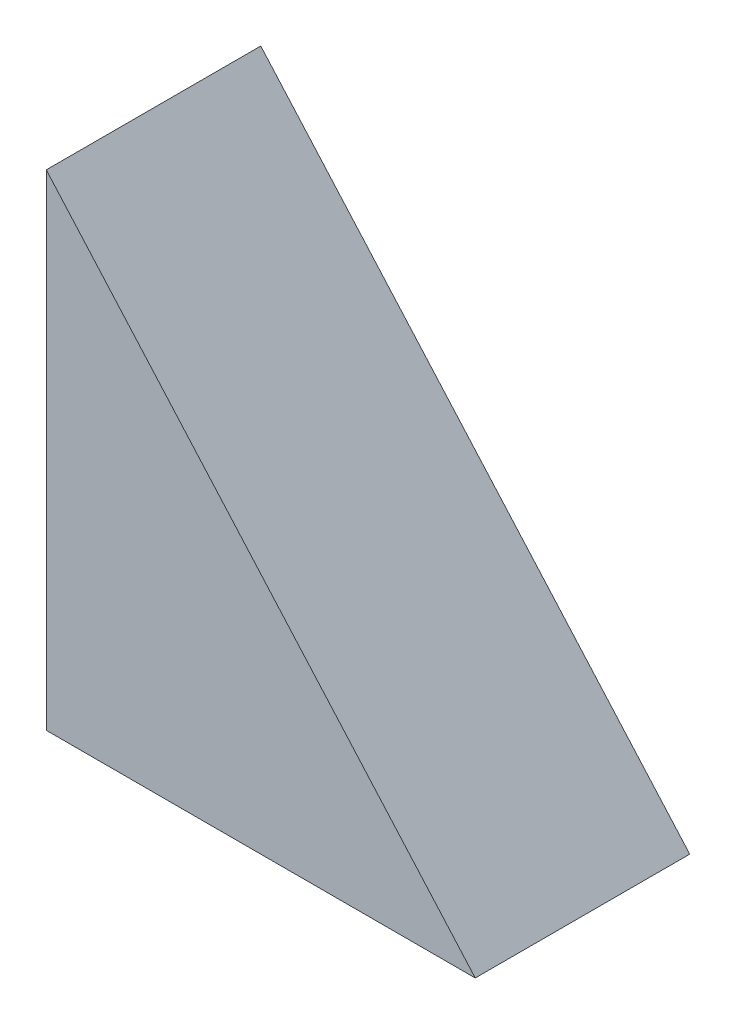
ISO-10303-21;
HEADER;
FILE_DESCRIPTION(('STEP AP214'),'2;1');
FILE_NAME('part.step','',(''),(''),'','','');
FILE_SCHEMA(('AUTOMOTIVE_DESIGN { 1 0 10303 214 1 1 1 1 }'));
ENDSEC;
DATA;
#1=APPLICATION_CONTEXT('core data for automotive mechanical design processes');
#2=APPLICATION_PROTOCOL_DEFINITION('international standard','automotive_design',2000,#1);
#3=PRODUCT_CONTEXT('',#1,'mechanical');
#4=PRODUCT('Part','Part','',(#3));
#5=PRODUCT_RELATED_PRODUCT_CATEGORY('part','',(#4));
#6=PRODUCT_DEFINITION_FORMATION('','',#4);
#7=PRODUCT_DEFINITION_CONTEXT('part definition',#1,'design');
#8=PRODUCT_DEFINITION('design','',#6,#7);
#9=PRODUCT_DEFINITION_SHAPE('','',#8);
#10=(LENGTH_UNIT() NAMED_UNIT(*) SI_UNIT(.MILLI.,.METRE.));
#11=(NAMED_UNIT(*) PLANE_ANGLE_UNIT() SI_UNIT($,.RADIAN.));
#12=(NAMED_UNIT(*) SI_UNIT($,.STERADIAN.) SOLID_ANGLE_UNIT());
#13=UNCERTAINTY_MEASURE_WITH_UNIT(LENGTH_MEASURE(1.E-05),#10,'distance_accuracy_value','');
#14=(GEOMETRIC_REPRESENTATION_CONTEXT(3) GLOBAL_UNCERTAINTY_ASSIGNED_CONTEXT((#13)) GLOBAL_UNIT_ASSIGNED_CONTEXT((#10,
#11,#12)) REPRESENTATION_CONTEXT('',''));
#15=CARTESIAN_POINT('',(0.,0.,0.));
#16=DIRECTION('',(0.,0.,1.));
#17=DIRECTION('',(1.,0.,0.));
#18=AXIS2_PLACEMENT_3D('',#15,#16,#17);
#19=CARTESIAN_POINT('',(0.,10.922,4.826));
#20=DIRECTION('',(1.,0.,0.));
#21=DIRECTION('',(0.,0.,-1.));
#22=AXIS2_PLACEMENT_3D('',#19,#20,#21);
#23=PLANE('',#22);
#24=DIRECTION('',(0.,-1.,0.));
#25=VECTOR('',#24,1.);
#26=CARTESIAN_POINT('',(0.,10.922,0.));
#27=LINE('',#26,#25);
#28=CARTESIAN_POINT('',(0.,10.922,0.));
#29=VERTEX_POINT('',#28);
#30=CARTESIAN_POINT('',(0.,0.,0.));
#31=VERTEX_POINT('',#30);
#32=EDGE_CURVE('E80',#29,#31,#27,.T.);
#33=ORIENTED_EDGE('',*,*,#32,.T.);
#34=DIRECTION('',(0.,0.,-1.));
#35=VECTOR('',#34,1.);
#36=CARTESIAN_POINT('',(0.,0.,4.826));
#37=LINE('',#36,#35);
#38=CARTESIAN_POINT('',(0.,0.,4.826));
#39=VERTEX_POINT('',#38);
#40=EDGE_CURVE('E11',#39,#31,#37,.T.);
#41=ORIENTED_EDGE('',*,*,#40,.F.);
#42=DIRECTION('',(0.,-1.,0.));
#43=VECTOR('',#42,1.);
#44=CARTESIAN_POINT('',(0.,10.922,4.826));
#45=LINE('',#44,#43);
#46=CARTESIAN_POINT('',(0.,10.922,4.826));
#47=VERTEX_POINT('',#46);
#48=EDGE_CURVE('E73',#47,#39,#45,.T.);
#49=ORIENTED_EDGE('',*,*,#48,.F.);
#50=DIRECTION('',(0.,0.,-1.));
#51=VECTOR('',#50,1.);
#52=CARTESIAN_POINT('',(0.,10.922,4.826));
#53=LINE('',#52,#51);
#54=EDGE_CURVE('E81',#47,#29,#53,.T.);
#55=ORIENTED_EDGE('',*,*,#54,.T.);
#56=EDGE_LOOP('',(#33,#41,#49,#55));
#57=FACE_BOUND('',#56,.T.);
#58=ADVANCED_FACE('F33',(#57),#23,.F.);
#59=CARTESIAN_POINT('',(0.,0.,4.826));
#60=DIRECTION('',(0.,1.,0.));
#61=DIRECTION('',(0.,0.,1.));
#62=AXIS2_PLACEMENT_3D('',#59,#60,#61);
#63=PLANE('',#62);
#64=DIRECTION('',(1.,0.,0.));
#65=VECTOR('',#64,1.);
#66=CARTESIAN_POINT('',(0.,0.,0.));
#67=LINE('',#66,#65);
#68=CARTESIAN_POINT('',(9.652,0.,0.));
#69=VERTEX_POINT('',#68);
#70=EDGE_CURVE('E61',#31,#69,#67,.T.);
#71=ORIENTED_EDGE('',*,*,#70,.T.);
#72=DIRECTION('',(0.,0.,-1.));
#73=VECTOR('',#72,1.);
#74=CARTESIAN_POINT('',(9.652,0.,4.826));
#75=LINE('',#74,#73);
#76=CARTESIAN_POINT('',(9.652,0.,4.826));
#77=VERTEX_POINT('',#76);
#78=EDGE_CURVE('E41',#77,#69,#75,.T.);
#79=ORIENTED_EDGE('',*,*,#78,.F.);
#80=DIRECTION('',(1.,0.,0.));
#81=VECTOR('',#80,1.);
#82=CARTESIAN_POINT('',(0.,0.,4.826));
#83=LINE('',#82,#81);
#84=EDGE_CURVE('E69',#39,#77,#83,.T.);
#85=ORIENTED_EDGE('',*,*,#84,.F.);
#86=ORIENTED_EDGE('',*,*,#40,.T.);
#87=EDGE_LOOP('',(#71,#79,#85,#86));
#88=FACE_BOUND('',#87,.T.);
#89=ADVANCED_FACE('F70',(#88),#63,.F.);
#90=CARTESIAN_POINT('',(9.652,0.,4.826));
#91=DIRECTION('',(-0.749329085481146,-0.662197796471711,0.));
#92=DIRECTION('',(0.662197796471711,-0.749329085481146,0.));
#93=AXIS2_PLACEMENT_3D('',#90,#91,#92);
#94=PLANE('',#93);
#95=DIRECTION('',(-0.662197796471711,0.749329085481146,0.));
#96=VECTOR('',#95,1.);
#97=CARTESIAN_POINT('',(9.652,0.,0.));
#98=LINE('',#97,#96);
#99=EDGE_CURVE('E66',#69,#29,#98,.T.);
#100=ORIENTED_EDGE('',*,*,#99,.T.);
#101=ORIENTED_EDGE('',*,*,#54,.F.);
#102=DIRECTION('',(-0.662197796471711,0.749329085481146,0.));
#103=VECTOR('',#102,1.);
#104=CARTESIAN_POINT('',(9.652,0.,4.826));
#105=LINE('',#104,#103);
#106=EDGE_CURVE('E49',#77,#47,#105,.T.);
#107=ORIENTED_EDGE('',*,*,#106,.F.);
#108=ORIENTED_EDGE('',*,*,#78,.T.);
#109=EDGE_LOOP('',(#100,#101,#107,#108));
#110=FACE_BOUND('',#109,.T.);
#111=ADVANCED_FACE('F88',(#110),#94,.F.);
#112=CARTESIAN_POINT('',(0.,0.,4.826));
#113=DIRECTION('',(0.,0.,1.));
#114=DIRECTION('',(1.,0.,0.));
#115=AXIS2_PLACEMENT_3D('',#112,#113,#114);
#116=PLANE('',#115);
#117=ORIENTED_EDGE('',*,*,#48,.T.);
#118=ORIENTED_EDGE('',*,*,#84,.T.);
#119=ORIENTED_EDGE('',*,*,#106,.T.);
#120=EDGE_LOOP('',(#117,#118,#119));
#121=FACE_BOUND('',#120,.T.);
#122=ADVANCED_FACE('F76',(#121),#116,.T.);
#123=CARTESIAN_POINT('',(0.,0.,0.));
#124=DIRECTION('',(0.,0.,1.));
#125=DIRECTION('',(1.,0.,0.));
#126=AXIS2_PLACEMENT_3D('',#123,#124,#125);
#127=PLANE('',#126);
#128=ORIENTED_EDGE('',*,*,#32,.F.);
#129=ORIENTED_EDGE('',*,*,#99,.F.);
#130=ORIENTED_EDGE('',*,*,#70,.F.);
#131=EDGE_LOOP('',(#128,#129,#130));
#132=FACE_BOUND('',#131,.T.);
#133=ADVANCED_FACE('F89',(#132),#127,.F.);
#134=CLOSED_SHELL('',(#58,#89,#111,#122,#133));
#135=MANIFOLD_SOLID_BREP('B2',#134);
#136=ADVANCED_BREP_SHAPE_REPRESENTATION('',(#18,#135),#14);
#137=SHAPE_DEFINITION_REPRESENTATION(#9,#136);
ENDSEC;
END-ISO-10303-21;
